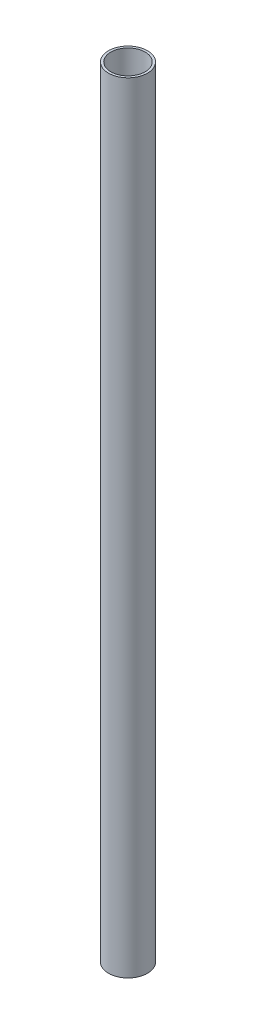
ISO-10303-21;
HEADER;
FILE_DESCRIPTION(('STEP AP214'),'2;1');
FILE_NAME('part.step','',(''),(''),'','','');
FILE_SCHEMA(('AUTOMOTIVE_DESIGN { 1 0 10303 214 1 1 1 1 }'));
ENDSEC;
DATA;
#1=APPLICATION_CONTEXT('core data for automotive mechanical design processes');
#2=APPLICATION_PROTOCOL_DEFINITION('international standard','automotive_design',2000,#1);
#3=PRODUCT_CONTEXT('',#1,'mechanical');
#4=PRODUCT('Part','Part','',(#3));
#5=PRODUCT_RELATED_PRODUCT_CATEGORY('part','',(#4));
#6=PRODUCT_DEFINITION_FORMATION('','',#4);
#7=PRODUCT_DEFINITION_CONTEXT('part definition',#1,'design');
#8=PRODUCT_DEFINITION('design','',#6,#7);
#9=PRODUCT_DEFINITION_SHAPE('','',#8);
#10=(LENGTH_UNIT() NAMED_UNIT(*) SI_UNIT(.MILLI.,.METRE.));
#11=(NAMED_UNIT(*) PLANE_ANGLE_UNIT() SI_UNIT($,.RADIAN.));
#12=(NAMED_UNIT(*) SI_UNIT($,.STERADIAN.) SOLID_ANGLE_UNIT());
#13=UNCERTAINTY_MEASURE_WITH_UNIT(LENGTH_MEASURE(1.E-05),#10,'distance_accuracy_value','');
#14=(GEOMETRIC_REPRESENTATION_CONTEXT(3) GLOBAL_UNCERTAINTY_ASSIGNED_CONTEXT((#13)) GLOBAL_UNIT_ASSIGNED_CONTEXT((#10,
#11,#12)) REPRESENTATION_CONTEXT('',''));
#15=CARTESIAN_POINT('',(0.,0.,0.));
#16=DIRECTION('',(0.,0.,1.));
#17=DIRECTION('',(1.,0.,0.));
#18=AXIS2_PLACEMENT_3D('',#15,#16,#17);
#19=CARTESIAN_POINT('',(0.,1000.,0.));
#20=DIRECTION('',(0.,-1.,0.));
#21=DIRECTION('',(0.,0.,-1.));
#22=AXIS2_PLACEMENT_3D('',#19,#20,#21);
#23=CYLINDRICAL_SURFACE('',#22,25.);
#24=CARTESIAN_POINT('',(0.,1000.,0.));
#25=DIRECTION('',(0.,1.,0.));
#26=DIRECTION('',(0.,0.,1.));
#27=AXIS2_PLACEMENT_3D('',#24,#25,#26);
#28=CIRCLE('',#27,25.);
#29=CARTESIAN_POINT('',(0.,1000.,25.));
#30=VERTEX_POINT('',#29);
#31=EDGE_CURVE('E10',#30,#30,#28,.T.);
#32=ORIENTED_EDGE('',*,*,#31,.F.);
#33=EDGE_LOOP('',(#32));
#34=FACE_BOUND('',#33,.T.);
#35=CARTESIAN_POINT('',(0.,0.,0.));
#36=DIRECTION('',(0.,1.,0.));
#37=DIRECTION('',(0.,0.,1.));
#38=AXIS2_PLACEMENT_3D('',#35,#36,#37);
#39=CIRCLE('',#38,25.);
#40=CARTESIAN_POINT('',(0.,0.,25.));
#41=VERTEX_POINT('',#40);
#42=EDGE_CURVE('E34',#41,#41,#39,.T.);
#43=ORIENTED_EDGE('',*,*,#42,.T.);
#44=EDGE_LOOP('',(#43));
#45=FACE_BOUND('',#44,.T.);
#46=ADVANCED_FACE('F31',(#34,#45),#23,.T.);
#47=CARTESIAN_POINT('',(0.,1000.,0.));
#48=DIRECTION('',(0.,1.,0.));
#49=DIRECTION('',(0.,0.,1.));
#50=AXIS2_PLACEMENT_3D('',#47,#48,#49);
#51=PLANE('',#50);
#52=CARTESIAN_POINT('',(0.,1000.,0.));
#53=DIRECTION('',(0.,-1.,0.));
#54=DIRECTION('',(0.,0.,-1.));
#55=AXIS2_PLACEMENT_3D('',#52,#53,#54);
#56=CIRCLE('',#55,22.);
#57=CARTESIAN_POINT('',(0.,1000.,-22.));
#58=VERTEX_POINT('',#57);
#59=EDGE_CURVE('E41',#58,#58,#56,.T.);
#60=ORIENTED_EDGE('',*,*,#59,.T.);
#61=EDGE_LOOP('',(#60));
#62=FACE_BOUND('',#61,.T.);
#63=ORIENTED_EDGE('',*,*,#31,.T.);
#64=EDGE_LOOP('',(#63));
#65=FACE_BOUND('',#64,.T.);
#66=ADVANCED_FACE('F49',(#62,#65),#51,.T.);
#67=CARTESIAN_POINT('',(0.,0.,0.));
#68=DIRECTION('',(0.,1.,0.));
#69=DIRECTION('',(0.,0.,1.));
#70=AXIS2_PLACEMENT_3D('',#67,#68,#69);
#71=PLANE('',#70);
#72=CARTESIAN_POINT('',(0.,0.,0.));
#73=DIRECTION('',(0.,-1.,0.));
#74=DIRECTION('',(0.,0.,-1.));
#75=AXIS2_PLACEMENT_3D('',#72,#73,#74);
#76=CIRCLE('',#75,22.);
#77=CARTESIAN_POINT('',(0.,0.,-22.));
#78=VERTEX_POINT('',#77);
#79=EDGE_CURVE('E43',#78,#78,#76,.T.);
#80=ORIENTED_EDGE('',*,*,#79,.F.);
#81=EDGE_LOOP('',(#80));
#82=FACE_BOUND('',#81,.T.);
#83=ORIENTED_EDGE('',*,*,#42,.F.);
#84=EDGE_LOOP('',(#83));
#85=FACE_BOUND('',#84,.T.);
#86=ADVANCED_FACE('F54',(#82,#85),#71,.F.);
#87=CARTESIAN_POINT('',(0.,1000.,0.));
#88=DIRECTION('',(0.,-1.,0.));
#89=DIRECTION('',(0.,0.,-1.));
#90=AXIS2_PLACEMENT_3D('',#87,#88,#89);
#91=CYLINDRICAL_SURFACE('',#90,22.);
#92=ORIENTED_EDGE('',*,*,#59,.F.);
#93=EDGE_LOOP('',(#92));
#94=FACE_BOUND('',#93,.T.);
#95=ORIENTED_EDGE('',*,*,#79,.T.);
#96=EDGE_LOOP('',(#95));
#97=FACE_BOUND('',#96,.T.);
#98=ADVANCED_FACE('F51',(#94,#97),#91,.F.);
#99=CLOSED_SHELL('',(#46,#66,#86,#98));
#100=MANIFOLD_SOLID_BREP('B2',#99);
#101=ADVANCED_BREP_SHAPE_REPRESENTATION('',(#18,#100),#14);
#102=SHAPE_DEFINITION_REPRESENTATION(#9,#101);
ENDSEC;
END-ISO-10303-21;
